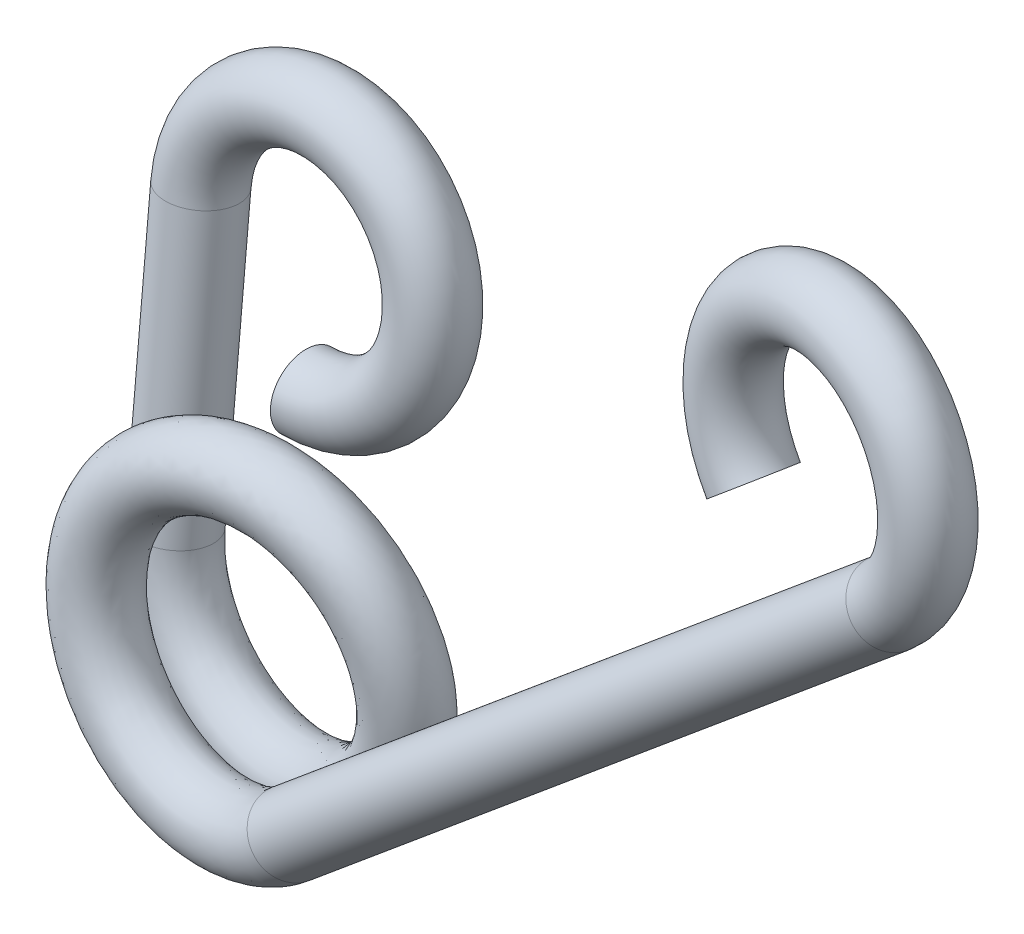
ISO-10303-21;
HEADER;
FILE_DESCRIPTION(('STEP AP214'),'2;1');
FILE_NAME('part.step','',(''),(''),'','','');
FILE_SCHEMA(('AUTOMOTIVE_DESIGN { 1 0 10303 214 1 1 1 1 }'));
ENDSEC;
DATA;
#1=APPLICATION_CONTEXT('core data for automotive mechanical design processes');
#2=APPLICATION_PROTOCOL_DEFINITION('international standard','automotive_design',2000,#1);
#3=PRODUCT_CONTEXT('',#1,'mechanical');
#4=PRODUCT('Part','Part','',(#3));
#5=PRODUCT_RELATED_PRODUCT_CATEGORY('part','',(#4));
#6=PRODUCT_DEFINITION_FORMATION('','',#4);
#7=PRODUCT_DEFINITION_CONTEXT('part definition',#1,'design');
#8=PRODUCT_DEFINITION('design','',#6,#7);
#9=PRODUCT_DEFINITION_SHAPE('','',#8);
#10=(LENGTH_UNIT() NAMED_UNIT(*) SI_UNIT(.MILLI.,.METRE.));
#11=(NAMED_UNIT(*) PLANE_ANGLE_UNIT() SI_UNIT($,.RADIAN.));
#12=(NAMED_UNIT(*) SI_UNIT($,.STERADIAN.) SOLID_ANGLE_UNIT());
#13=UNCERTAINTY_MEASURE_WITH_UNIT(LENGTH_MEASURE(1.E-05),#10,'distance_accuracy_value','');
#14=(GEOMETRIC_REPRESENTATION_CONTEXT(3) GLOBAL_UNCERTAINTY_ASSIGNED_CONTEXT((#13)) GLOBAL_UNIT_ASSIGNED_CONTEXT((#10,
#11,#12)) REPRESENTATION_CONTEXT('',''));
#15=CARTESIAN_POINT('',(0.,0.,0.));
#16=DIRECTION('',(0.,0.,1.));
#17=DIRECTION('',(1.,0.,0.));
#18=AXIS2_PLACEMENT_3D('',#15,#16,#17);
#19=CARTESIAN_POINT('',(-2.925,-0.0704165836283418,-0.765267113333714));
#20=CARTESIAN_POINT('',(-2.90212026503772,-1.02080669510959,-0.680712434641493));
#21=CARTESIAN_POINT('',(-2.32498487917316,-1.77624007579664,-0.596157755949272));
#22=CARTESIAN_POINT('',(-1.7478494933086,-2.53167345648368,-0.511603077257051));
#23=CARTESIAN_POINT('',(-0.836904557831744,-2.80360023119031,-0.42704839856483));
#24=CARTESIAN_POINT('',(0.074040377645116,-3.07552700589693,-0.342493719872609));
#25=CARTESIAN_POINT('',(0.970844859261698,-2.76008038913634,-0.257939041180388));
#26=CARTESIAN_POINT('',(1.86764934087828,-2.44463377237575,-0.173384362488167));
#27=CARTESIAN_POINT('',(2.40776453792028,-1.66230365011433,-0.0888296837959465));
#28=CARTESIAN_POINT('',(2.94787973496228,-0.87997352785291,-0.00427500510372558));
#29=CARTESIAN_POINT('',(2.925,0.0704165836283414,0.0802796735884954));
#30=CARTESIAN_POINT('',(2.90212026503772,1.02080669510959,0.164834352280716));
#31=CARTESIAN_POINT('',(2.32498487917316,1.77624007579664,0.249389030972937));
#32=CARTESIAN_POINT('',(1.74784949330861,2.53167345648368,0.333943709665158));
#33=CARTESIAN_POINT('',(0.836904557831745,2.80360023119031,0.418498388357379));
#34=CARTESIAN_POINT('',(-0.0740403776451156,3.07552700589693,0.5030530670496));
#35=CARTESIAN_POINT('',(-0.970844859261698,2.76008038913634,0.587607745741821));
#36=CARTESIAN_POINT('',(-1.86764934087828,2.44463377237575,0.672162424434042));
#37=CARTESIAN_POINT('',(-2.40776453792028,1.66230365011433,0.756717103126263));
#38=CARTESIAN_POINT('',(-2.94787973496228,0.87997352785291,0.841271781818484));
#39=CARTESIAN_POINT('',(-2.925,-0.0704165836283418,0.925826460510705));
#40=CARTESIAN_POINT('',(-2.90212026503772,-1.02080669510959,1.01038113920293));
#41=CARTESIAN_POINT('',(-2.32498487917316,-1.77624007579664,1.09493581789515));
#42=CARTESIAN_POINT('',(-1.7478494933086,-2.53167345648368,1.17949049658737));
#43=CARTESIAN_POINT('',(-0.836904557831744,-2.80360023119031,1.26404517527959));
#44=CARTESIAN_POINT('',(0.074040377645116,-3.07552700589693,1.34859985397181));
#45=CARTESIAN_POINT('',(0.970844859261698,-2.76008038913634,1.43315453266403));
#46=CARTESIAN_POINT('',(1.5192311705279,-2.56718817002642,1.48485881079692));
#47=CARTESIAN_POINT('',(1.95222719081488,-2.17931009512022,1.53905817812549));
#48=CARTESIAN_POINT('',(-1.388,-0.0704165836283317,-0.765267113333715));
#49=CARTESIAN_POINT('',(-1.36512026503772,-0.521405121999606,-0.680712434641494));
#50=CARTESIAN_POINT('',(-1.08152575881887,-0.872814143023098,-0.596157755949273));
#51=CARTESIAN_POINT('',(-0.797931252600025,-1.22422316404659,-0.511603077257052));
#52=CARTESIAN_POINT('',(-0.36194543747746,-1.34182636564465,-0.427048398564831));
#53=CARTESIAN_POINT('',(0.0740403776451055,-1.45942956724271,-0.342493719872611));
#54=CARTESIAN_POINT('',(0.495885738907394,-1.29830652359069,-0.257939041180389));
#55=CARTESIAN_POINT('',(0.917731100169684,-1.13718347993867,-0.173384362488168));
#56=CARTESIAN_POINT('',(1.16430541756598,-0.758877717340808,-0.0888296837959475));
#57=CARTESIAN_POINT('',(1.41087973496228,-0.380571954742942,-0.00427500510372656));
#58=CARTESIAN_POINT('',(1.388,0.0704165836283316,0.0802796735884944));
#59=CARTESIAN_POINT('',(1.36512026503772,0.521405121999606,0.164834352280715));
#60=CARTESIAN_POINT('',(1.08152575881887,0.872814143023098,0.249389030972936));
#61=CARTESIAN_POINT('',(0.797931252600025,1.22422316404659,0.333943709665157));
#62=CARTESIAN_POINT('',(0.36194543747746,1.34182636564465,0.418498388357378));
#63=CARTESIAN_POINT('',(-0.0740403776451053,1.45942956724271,0.503053067049599));
#64=CARTESIAN_POINT('',(-0.495885738907394,1.29830652359069,0.58760774574182));
#65=CARTESIAN_POINT('',(-0.917731100169683,1.13718347993867,0.672162424434041));
#66=CARTESIAN_POINT('',(-1.16430541756598,0.758877717340808,0.756717103126262));
#67=CARTESIAN_POINT('',(-1.41087973496228,0.380571954742943,0.841271781818483));
#68=CARTESIAN_POINT('',(-1.388,-0.0704165836283317,0.925826460510704));
#69=CARTESIAN_POINT('',(-1.36512026503772,-0.521405121999606,1.01038113920293));
#70=CARTESIAN_POINT('',(-1.08152575881887,-0.872814143023098,1.09493581789515));
#71=CARTESIAN_POINT('',(-0.797931252600025,-1.22422316404659,1.17949049658737));
#72=CARTESIAN_POINT('',(-0.36194543747746,-1.34182636564465,1.26404517527959));
#73=CARTESIAN_POINT('',(0.0740403776451055,-1.45942956724271,1.34859985397181));
#74=CARTESIAN_POINT('',(0.495885738907394,-1.29830652359069,1.43315453266403));
#75=CARTESIAN_POINT('',(0.753839647846812,-1.19978151242099,1.48485881079692));
#76=CARTESIAN_POINT('',(0.95453711154986,-1.01012939662399,1.53905817812549));
#77=CARTESIAN_POINT('',(-1.388,0.070416583628311,0.765267113333713));
#78=CARTESIAN_POINT('',(-1.41087973496227,-0.380571954742963,0.849821792025934));
#79=CARTESIAN_POINT('',(-1.16430541756597,-0.758877717340824,0.934376470718155));
#80=CARTESIAN_POINT('',(-0.917731100169666,-1.13718347993869,1.01893114941038));
#81=CARTESIAN_POINT('',(-0.495885738907375,-1.2983065235907,1.1034858281026));
#82=CARTESIAN_POINT('',(-0.0740403776450839,-1.45942956724271,1.18804050679482));
#83=CARTESIAN_POINT('',(0.361945437477479,-1.34182636564465,1.27259518548704));
#84=CARTESIAN_POINT('',(0.797931252600042,-1.22422316404658,1.35714986417926));
#85=CARTESIAN_POINT('',(1.08152575881889,-0.872814143023081,1.44170454287148));
#86=CARTESIAN_POINT('',(1.36512026503773,-0.521405121999585,1.5262592215637));
#87=CARTESIAN_POINT('',(1.388,-0.0704165836283111,1.61081390025592));
#88=CARTESIAN_POINT('',(1.41087973496227,0.380571954742963,1.69536857894814));
#89=CARTESIAN_POINT('',(1.16430541756597,0.758877717340824,1.77992325764037));
#90=CARTESIAN_POINT('',(0.917731100169666,1.13718347993869,1.86447793633259));
#91=CARTESIAN_POINT('',(0.495885738907375,1.2983065235907,1.94903261502481));
#92=CARTESIAN_POINT('',(0.0740403776450841,1.45942956724271,2.03358729371703));
#93=CARTESIAN_POINT('',(-0.361945437477479,1.34182636564465,2.11814197240925));
#94=CARTESIAN_POINT('',(-0.797931252600042,1.22422316404658,2.20269665110147));
#95=CARTESIAN_POINT('',(-1.08152575881889,0.872814143023081,2.28725132979369));
#96=CARTESIAN_POINT('',(-1.36512026503773,0.521405121999585,2.37180600848591));
#97=CARTESIAN_POINT('',(-1.388,0.070416583628311,2.45636068717813));
#98=CARTESIAN_POINT('',(-1.41087973496227,-0.380571954742963,2.54091536587035));
#99=CARTESIAN_POINT('',(-1.16430541756597,-0.758877717340824,2.62547004456257));
#100=CARTESIAN_POINT('',(-0.917731100169666,-1.13718347993869,2.7100247232548));
#101=CARTESIAN_POINT('',(-0.495885738907375,-1.2983065235907,2.79457940194702));
#102=CARTESIAN_POINT('',(-0.0740403776450839,-1.45942956724271,2.87913408063924));
#103=CARTESIAN_POINT('',(0.361945437477479,-1.34182636564465,2.96368875933146));
#104=CARTESIAN_POINT('',(0.628546082122418,-1.26991327060613,3.01539303746435));
#105=CARTESIAN_POINT('',(0.847406714110328,-1.10154634769973,3.06959240479292));
#106=CARTESIAN_POINT('',(-2.925,0.0704165836283009,0.765267113333714));
#107=CARTESIAN_POINT('',(-2.94787973496227,-0.87997352785295,0.849821792025935));
#108=CARTESIAN_POINT('',(-2.40776453792026,-1.66230365011436,0.934376470718156));
#109=CARTESIAN_POINT('',(-1.86764934087825,-2.44463377237578,1.01893114941038));
#110=CARTESIAN_POINT('',(-0.97084485926166,-2.76008038913636,1.1034858281026));
#111=CARTESIAN_POINT('',(-0.0740403776450734,-3.07552700589693,1.18804050679482));
#112=CARTESIAN_POINT('',(0.836904557831783,-2.80360023119029,1.27259518548704));
#113=CARTESIAN_POINT('',(1.74784949330864,-2.53167345648366,1.35714986417926));
#114=CARTESIAN_POINT('',(2.32498487917319,-1.7762400757966,1.44170454287148));
#115=CARTESIAN_POINT('',(2.90212026503773,-1.02080669510955,1.5262592215637));
#116=CARTESIAN_POINT('',(2.925,-0.0704165836283013,1.61081390025592));
#117=CARTESIAN_POINT('',(2.94787973496227,0.87997352785295,1.69536857894815));
#118=CARTESIAN_POINT('',(2.40776453792026,1.66230365011436,1.77992325764037));
#119=CARTESIAN_POINT('',(1.86764934087825,2.44463377237578,1.86447793633259));
#120=CARTESIAN_POINT('',(0.97084485926166,2.76008038913636,1.94903261502481));
#121=CARTESIAN_POINT('',(0.0740403776450738,3.07552700589693,2.03358729371703));
#122=CARTESIAN_POINT('',(-0.836904557831783,2.80360023119029,2.11814197240925));
#123=CARTESIAN_POINT('',(-1.74784949330864,2.53167345648366,2.20269665110147));
#124=CARTESIAN_POINT('',(-2.32498487917319,1.77624007579661,2.28725132979369));
#125=CARTESIAN_POINT('',(-2.90212026503773,1.02080669510955,2.37180600848591));
#126=CARTESIAN_POINT('',(-2.925,0.0704165836283009,2.45636068717813));
#127=CARTESIAN_POINT('',(-2.94787973496227,-0.87997352785295,2.54091536587035));
#128=CARTESIAN_POINT('',(-2.40776453792026,-1.66230365011436,2.62547004456258));
#129=CARTESIAN_POINT('',(-1.86764934087825,-2.44463377237578,2.7100247232548));
#130=CARTESIAN_POINT('',(-0.97084485926166,-2.76008038913636,2.79457940194702));
#131=CARTESIAN_POINT('',(-0.0740403776450734,-3.07552700589693,2.87913408063924));
#132=CARTESIAN_POINT('',(0.836904557831783,-2.80360023119029,2.96368875933146));
#133=CARTESIAN_POINT('',(1.39393760480351,-2.63731992821156,3.01539303746435));
#134=CARTESIAN_POINT('',(1.84509679337535,-2.27072704619597,3.06959240479292));
#135=CARTESIAN_POINT('',(-4.462,0.0704165836282909,0.765267113333715));
#136=CARTESIAN_POINT('',(-4.48487973496226,-1.37937510096294,0.849821792025936));
#137=CARTESIAN_POINT('',(-3.65122365827454,-2.5657295828879,0.934376470718157));
#138=CARTESIAN_POINT('',(-2.81756758158683,-3.75208406481287,1.01893114941038));
#139=CARTESIAN_POINT('',(-1.44580397961594,-4.22185425468201,1.1034858281026));
#140=CARTESIAN_POINT('',(-0.074040377645063,-4.69162444455115,1.18804050679482));
#141=CARTESIAN_POINT('',(1.31186367818609,-4.26537409673594,1.27259518548704));
#142=CARTESIAN_POINT('',(2.69776773401724,-3.83912374892074,1.35714986417926));
#143=CARTESIAN_POINT('',(3.56844399952749,-2.67966600857013,1.44170454287148));
#144=CARTESIAN_POINT('',(4.43912026503774,-1.52020826821952,1.5262592215637));
#145=CARTESIAN_POINT('',(4.462,-0.0704165836282915,1.61081390025592));
#146=CARTESIAN_POINT('',(4.48487973496226,1.37937510096294,1.69536857894815));
#147=CARTESIAN_POINT('',(3.65122365827454,2.5657295828879,1.77992325764037));
#148=CARTESIAN_POINT('',(2.81756758158683,3.75208406481287,1.86447793633259));
#149=CARTESIAN_POINT('',(1.44580397961594,4.22185425468201,1.94903261502481));
#150=CARTESIAN_POINT('',(0.0740403776450636,4.69162444455115,2.03358729371703));
#151=CARTESIAN_POINT('',(-1.31186367818609,4.26537409673594,2.11814197240925));
#152=CARTESIAN_POINT('',(-2.69776773401724,3.83912374892074,2.20269665110147));
#153=CARTESIAN_POINT('',(-3.56844399952749,2.67966600857013,2.28725132979369));
#154=CARTESIAN_POINT('',(-4.43912026503774,1.52020826821952,2.37180600848591));
#155=CARTESIAN_POINT('',(-4.462,0.0704165836282909,2.45636068717813));
#156=CARTESIAN_POINT('',(-4.48487973496226,-1.37937510096294,2.54091536587036));
#157=CARTESIAN_POINT('',(-3.65122365827454,-2.5657295828879,2.62547004456258));
#158=CARTESIAN_POINT('',(-2.81756758158683,-3.75208406481287,2.7100247232548));
#159=CARTESIAN_POINT('',(-1.44580397961594,-4.22185425468201,2.79457940194702));
#160=CARTESIAN_POINT('',(-0.074040377645063,-4.69162444455115,2.87913408063924));
#161=CARTESIAN_POINT('',(1.31186367818609,-4.26537409673594,2.96368875933146));
#162=CARTESIAN_POINT('',(2.1593291274846,-4.004726585817,3.01539303746435));
#163=CARTESIAN_POINT('',(2.84278687264038,-3.43990774469221,3.06959240479292));
#164=CARTESIAN_POINT('',(-4.462,-0.0704165836283518,-0.765267113333713));
#165=CARTESIAN_POINT('',(-4.43912026503772,-1.52020826821958,-0.680712434641492));
#166=CARTESIAN_POINT('',(-3.56844399952745,-2.67966600857018,-0.596157755949271));
#167=CARTESIAN_POINT('',(-2.69776773401719,-3.83912374892077,-0.51160307725705));
#168=CARTESIAN_POINT('',(-1.31186367818603,-4.26537409673596,-0.427048398564829));
#169=CARTESIAN_POINT('',(0.0740403776451265,-4.69162444455115,-0.342493719872609));
#170=CARTESIAN_POINT('',(1.445803979616,-4.22185425468199,-0.257939041180387));
#171=CARTESIAN_POINT('',(2.81756758158688,-3.75208406481283,-0.173384362488166));
#172=CARTESIAN_POINT('',(3.65122365827458,-2.56572958288785,-0.0888296837959456));
#173=CARTESIAN_POINT('',(4.48487973496228,-1.37937510096288,-0.00427500510372461));
#174=CARTESIAN_POINT('',(4.462,0.0704165836283513,0.0802796735884963));
#175=CARTESIAN_POINT('',(4.43912026503772,1.52020826821958,0.164834352280717));
#176=CARTESIAN_POINT('',(3.56844399952745,2.67966600857018,0.249389030972938));
#177=CARTESIAN_POINT('',(2.69776773401719,3.83912374892077,0.333943709665159));
#178=CARTESIAN_POINT('',(1.31186367818603,4.26537409673596,0.41849838835738));
#179=CARTESIAN_POINT('',(-0.0740403776451259,4.69162444455115,0.503053067049601));
#180=CARTESIAN_POINT('',(-1.445803979616,4.22185425468199,0.587607745741822));
#181=CARTESIAN_POINT('',(-2.81756758158688,3.75208406481283,0.672162424434043));
#182=CARTESIAN_POINT('',(-3.65122365827458,2.56572958288786,0.756717103126264));
#183=CARTESIAN_POINT('',(-4.48487973496228,1.37937510096288,0.841271781818485));
#184=CARTESIAN_POINT('',(-4.462,-0.0704165836283518,0.925826460510706));
#185=CARTESIAN_POINT('',(-4.43912026503772,-1.52020826821958,1.01038113920293));
#186=CARTESIAN_POINT('',(-3.56844399952745,-2.67966600857018,1.09493581789515));
#187=CARTESIAN_POINT('',(-2.69776773401719,-3.83912374892077,1.17949049658737));
#188=CARTESIAN_POINT('',(-1.31186367818603,-4.26537409673596,1.26404517527959));
#189=CARTESIAN_POINT('',(0.0740403776451265,-4.69162444455115,1.34859985397181));
#190=CARTESIAN_POINT('',(1.445803979616,-4.22185425468199,1.43315453266403));
#191=CARTESIAN_POINT('',(2.28462269320899,-3.93459482763186,1.48485881079692));
#192=CARTESIAN_POINT('',(2.94991727007991,-3.34849079361646,1.53905817812549));
#193=CARTESIAN_POINT('',(-2.925,-0.0704165836283418,-0.765267113333714));
#194=CARTESIAN_POINT('',(-2.90212026503772,-1.02080669510959,-0.680712434641493));
#195=CARTESIAN_POINT('',(-2.32498487917316,-1.77624007579664,-0.596157755949272));
#196=CARTESIAN_POINT('',(-1.7478494933086,-2.53167345648368,-0.511603077257051));
#197=CARTESIAN_POINT('',(-0.836904557831744,-2.80360023119031,-0.42704839856483));
#198=CARTESIAN_POINT('',(0.074040377645116,-3.07552700589693,-0.342493719872609));
#199=CARTESIAN_POINT('',(0.970844859261698,-2.76008038913634,-0.257939041180388));
#200=CARTESIAN_POINT('',(1.86764934087828,-2.44463377237575,-0.173384362488167));
#201=CARTESIAN_POINT('',(2.40776453792028,-1.66230365011433,-0.0888296837959465));
#202=CARTESIAN_POINT('',(2.94787973496228,-0.87997352785291,-0.00427500510372558));
#203=CARTESIAN_POINT('',(2.925,0.0704165836283414,0.0802796735884954));
#204=CARTESIAN_POINT('',(2.90212026503772,1.02080669510959,0.164834352280716));
#205=CARTESIAN_POINT('',(2.32498487917316,1.77624007579664,0.249389030972937));
#206=CARTESIAN_POINT('',(1.74784949330861,2.53167345648368,0.333943709665158));
#207=CARTESIAN_POINT('',(0.836904557831745,2.80360023119031,0.418498388357379));
#208=CARTESIAN_POINT('',(-0.0740403776451156,3.07552700589693,0.5030530670496));
#209=CARTESIAN_POINT('',(-0.970844859261698,2.76008038913634,0.587607745741821));
#210=CARTESIAN_POINT('',(-1.86764934087828,2.44463377237575,0.672162424434042));
#211=CARTESIAN_POINT('',(-2.40776453792028,1.66230365011433,0.756717103126263));
#212=CARTESIAN_POINT('',(-2.94787973496228,0.87997352785291,0.841271781818484));
#213=CARTESIAN_POINT('',(-2.925,-0.0704165836283418,0.925826460510705));
#214=CARTESIAN_POINT('',(-2.90212026503772,-1.02080669510959,1.01038113920293));
#215=CARTESIAN_POINT('',(-2.32498487917316,-1.77624007579664,1.09493581789515));
#216=CARTESIAN_POINT('',(-1.7478494933086,-2.53167345648368,1.17949049658737));
#217=CARTESIAN_POINT('',(-0.836904557831744,-2.80360023119031,1.26404517527959));
#218=CARTESIAN_POINT('',(0.074040377645116,-3.07552700589693,1.34859985397181));
#219=CARTESIAN_POINT('',(0.970844859261698,-2.76008038913634,1.43315453266403));
#220=CARTESIAN_POINT('',(1.5192311705279,-2.56718817002642,1.48485881079692));
#221=CARTESIAN_POINT('',(1.95222719081488,-2.17931009512022,1.53905817812549));
#222=(BOUNDED_SURFACE() B_SPLINE_SURFACE(3,2,((#19,#20,#21,#22,#23,#24,#25,#26,#27,#28,#29,#30,
#31,#32,#33,#34,#35,#36,#37,#38,#39,#40,#41,#42,#43,#44,#45,#46,#47),(#48,#49,#50,#51,#52,#53,
#54,#55,#56,#57,#58,#59,#60,#61,#62,#63,#64,#65,#66,#67,#68,#69,#70,#71,#72,#73,#74,#75,#76),
(#77,#78,#79,#80,#81,#82,#83,#84,#85,#86,#87,#88,#89,#90,#91,#92,#93,#94,#95,#96,#97,#98,#99,
#100,#101,#102,#103,#104,#105),(#106,#107,#108,#109,#110,#111,#112,#113,#114,#115,#116,#117,
#118,#119,#120,#121,#122,#123,#124,#125,#126,#127,#128,#129,#130,#131,#132,#133,#134),(#135,
#136,#137,#138,#139,#140,#141,#142,#143,#144,#145,#146,#147,#148,#149,#150,#151,#152,#153,#154,
#155,#156,#157,#158,#159,#160,#161,#162,#163),(#164,#165,#166,#167,#168,#169,#170,#171,#172,
#173,#174,#175,#176,#177,#178,#179,#180,#181,#182,#183,#184,#185,#186,#187,#188,#189,#190,#191,
#192),(#193,#194,#195,#196,#197,#198,#199,#200,#201,#202,#203,#204,#205,#206,#207,#208,#209,
#210,#211,#212,#213,#214,#215,#216,#217,#218,#219,#220,#221)),.UNSPECIFIED.,.T.,.F.,
.F.) B_SPLINE_SURFACE_WITH_KNOTS((4,3,4),(3,2,2,2,2,2,2,2,2,2,2,2,2,2,3),(0.,0.5,1.),(0.,0.05,
0.1,0.15,0.2,0.25,0.3,0.35,0.4,0.45,0.5,0.55,0.6,0.65,0.681167107840135),
.UNSPECIFIED.) GEOMETRIC_REPRESENTATION_ITEM() RATIONAL_B_SPLINE_SURFACE(((1.,0.951056516295154,
1.,0.951056516295154,1.,0.951056516295154,1.,0.951056516295154,1.,0.951056516295154,1.,
0.951056516295154,1.,0.951056516295154,1.,0.951056516295154,1.,0.951056516295154,1.,
0.951056516295154,1.,0.951056516295154,1.,0.951056516295154,1.,0.951056516295154,1.,
0.969491463305984,0.977017440739452),(0.333333333333333,0.317018838765051,0.333333333333333,
0.317018838765051,0.333333333333333,0.317018838765051,0.333333333333333,0.317018838765051,
0.333333333333333,0.317018838765051,0.333333333333333,0.317018838765051,0.333333333333333,
0.317018838765051,0.333333333333333,0.317018838765051,0.333333333333333,0.317018838765051,
0.333333333333333,0.317018838765051,0.333333333333333,0.317018838765051,0.333333333333333,
0.317018838765051,0.333333333333333,0.317018838765051,0.333333333333333,0.323163821101995,
0.325672480246484),(0.333333333333333,0.317018838765051,0.333333333333333,0.317018838765051,
0.333333333333333,0.317018838765051,0.333333333333333,0.317018838765051,0.333333333333333,
0.317018838765051,0.333333333333333,0.317018838765051,0.333333333333333,0.317018838765051,
0.333333333333333,0.317018838765051,0.333333333333333,0.317018838765051,0.333333333333333,
0.317018838765051,0.333333333333333,0.317018838765051,0.333333333333333,0.317018838765051,
0.333333333333333,0.317018838765051,0.333333333333333,0.323163821101995,0.325672480246484),(1.,
0.951056516295154,1.,0.951056516295154,1.,0.951056516295154,1.,0.951056516295154,1.,
0.951056516295154,1.,0.951056516295154,1.,0.951056516295154,1.,0.951056516295154,1.,
0.951056516295154,1.,0.951056516295154,1.,0.951056516295154,1.,0.951056516295154,1.,
0.951056516295154,1.,0.969491463305984,0.977017440739452),(0.333333333333333,0.317018838765051,
0.333333333333333,0.317018838765051,0.333333333333333,0.317018838765051,0.333333333333333,
0.317018838765051,0.333333333333333,0.317018838765051,0.333333333333333,0.317018838765051,
0.333333333333333,0.317018838765051,0.333333333333333,0.317018838765051,0.333333333333333,
0.317018838765051,0.333333333333333,0.317018838765051,0.333333333333333,0.317018838765051,
0.333333333333333,0.317018838765051,0.333333333333333,0.317018838765051,0.333333333333333,
0.323163821101995,0.325672480246484),(0.333333333333333,0.317018838765051,0.333333333333333,
0.317018838765051,0.333333333333333,0.317018838765051,0.333333333333333,0.317018838765051,
0.333333333333333,0.317018838765051,0.333333333333333,0.317018838765051,0.333333333333333,
0.317018838765051,0.333333333333333,0.317018838765051,0.333333333333333,0.317018838765051,
0.333333333333333,0.317018838765051,0.333333333333333,0.317018838765051,0.333333333333333,
0.317018838765051,0.333333333333333,0.317018838765051,0.333333333333333,0.323163821101995,
0.325672480246484),(1.,0.951056516295154,1.,0.951056516295154,1.,0.951056516295154,1.,
0.951056516295154,1.,0.951056516295154,1.,0.951056516295154,1.,0.951056516295154,1.,
0.951056516295154,1.,0.951056516295154,1.,0.951056516295154,1.,0.951056516295154,1.,
0.951056516295154,1.,0.951056516295154,1.,0.969491463305984,0.977017440739452))) REPRESENTATION_ITEM('') SURFACE());
#223=CARTESIAN_POINT('',(-2.925,0.,0.));
#224=DIRECTION('',(0.,0.995793250922205,-0.0916286058924155));
#225=DIRECTION('',(0.,0.0916286058924155,0.995793250922205));
#226=AXIS2_PLACEMENT_3D('',#223,#224,#225);
#227=CIRCLE('',#226,0.7685);
#228=CARTESIAN_POINT('',(-2.925,0.0704165836283021,0.765267113333715));
#229=VERTEX_POINT('',#228);
#230=EDGE_CURVE('E49',#229,#229,#227,.T.);
#231=CARTESIAN_POINT('',(1.95222719081488,-2.17931009512022,1.53905817812549));
#232=CARTESIAN_POINT('',(2.94991727007991,-3.34849079361646,1.53905817812549));
#233=CARTESIAN_POINT('',(2.84278687264038,-3.43990774469221,3.06959240479292));
#234=CARTESIAN_POINT('',(1.84509679337535,-2.27072704619597,3.06959240479292));
#235=CARTESIAN_POINT('',(0.847406714110328,-1.10154634769973,3.06959240479292));
#236=CARTESIAN_POINT('',(0.95453711154986,-1.01012939662399,1.53905817812549));
#237=CARTESIAN_POINT('',(1.95222719081488,-2.17931009512022,1.53905817812549));
#238=(BOUNDED_CURVE() B_SPLINE_CURVE(3,(#231,#232,#233,#234,#235,#236,#237),.UNSPECIFIED.,.T.,
.F.) B_SPLINE_CURVE_WITH_KNOTS((4,3,4),(0.,0.5,1.),
.UNSPECIFIED.) CURVE() GEOMETRIC_REPRESENTATION_ITEM() RATIONAL_B_SPLINE_CURVE((0.977017440739452,
0.325672480246484,0.325672480246484,0.977017440739452,0.325672480246484,0.325672480246484,0.977017440739452)) REPRESENTATION_ITEM(''));
#239=CARTESIAN_POINT('',(1.95222719081488,-2.17931009512022,1.53905817812549));
#240=VERTEX_POINT('',#239);
#241=EDGE_CURVE('E63',#240,#240,#238,.F.);
#242=ORIENTED_EDGE('',*,*,#230,.F.);
#243=EDGE_LOOP('',(#242));
#244=FACE_BOUND('',#243,.T.);
#245=ORIENTED_EDGE('',*,*,#241,.F.);
#246=EDGE_LOOP('',(#245));
#247=FACE_BOUND('',#246,.T.);
#248=ADVANCED_FACE('F37',(#244,#247),#222,.T.);
#249=CARTESIAN_POINT('',(-2.92500000000004,6.0862883496365,-0.560034039214444));
#250=DIRECTION('',(0.,-0.995793250922205,0.0916286058924155));
#251=DIRECTION('',(0.,-0.0916286058924155,-0.995793250922205));
#252=AXIS2_PLACEMENT_3D('',#249,#250,#251);
#253=CYLINDRICAL_SURFACE('',#252,0.7685);
#254=CARTESIAN_POINT('',(-2.92500000000004,6.0862883496365,-0.560034039214444));
#255=DIRECTION('',(0.,0.995793250922205,-0.0916286058924155));
#256=DIRECTION('',(0.,0.0916286058924155,0.995793250922205));
#257=AXIS2_PLACEMENT_3D('',#254,#255,#256);
#258=CIRCLE('',#257,0.7685);
#259=CARTESIAN_POINT('',(-3.69350000000004,6.0862883496365,-0.560034039214444));
#260=VERTEX_POINT('',#259);
#261=EDGE_CURVE('E11',#260,#260,#258,.T.);
#262=ORIENTED_EDGE('',*,*,#261,.F.);
#263=EDGE_LOOP('',(#262));
#264=FACE_BOUND('',#263,.T.);
#265=ORIENTED_EDGE('',*,*,#230,.T.);
#266=EDGE_LOOP('',(#265));
#267=FACE_BOUND('',#266,.T.);
#268=ADVANCED_FACE('F93',(#264,#267),#253,.T.);
#269=CARTESIAN_POINT('',(16.625784073203,10.3419897757369,4.08576864721955));
#270=DIRECTION('',(-0.75749007720954,-0.646384546157547,-0.0916286058924155));
#271=DIRECTION('',(0.649115210972689,-0.7606901096267,0.));
#272=AXIS2_PLACEMENT_3D('',#269,#270,#271);
#273=CYLINDRICAL_SURFACE('',#272,0.7685);
#274=CARTESIAN_POINT('',(16.625784073203,10.3419897757369,4.08576864721955));
#275=DIRECTION('',(0.75749007720954,0.646384546157547,0.0916286058924155));
#276=DIRECTION('',(-0.649115210972689,0.7606901096267,0.));
#277=AXIS2_PLACEMENT_3D('',#274,#275,#276);
#278=CIRCLE('',#277,0.7685);
#279=CARTESIAN_POINT('',(17.1145293095132,9.75615354967415,4.17805223306553));
#280=VERTEX_POINT('',#279);
#281=EDGE_CURVE('E54',#280,#280,#278,.T.);
#282=ORIENTED_EDGE('',*,*,#281,.F.);
#283=EDGE_LOOP('',(#282));
#284=FACE_BOUND('',#283,.T.);
#285=ORIENTED_EDGE('',*,*,#241,.T.);
#286=EDGE_LOOP('',(#285));
#287=FACE_BOUND('',#286,.T.);
#288=ADVANCED_FACE('F72',(#284,#287),#273,.T.);
#289=CARTESIAN_POINT('',(-0.425000000000058,3.59680522233098,-0.330962524483404));
#290=DIRECTION('',(-1.,0.,0.));
#291=DIRECTION('',(0.,0.0916286058924158,0.995793250922205));
#292=AXIS2_PLACEMENT_3D('',#289,#290,#291);
#293=PLANE('',#292);
#294=CARTESIAN_POINT('',(-0.425000000000058,3.59680522233098,-0.330962524483404));
#295=DIRECTION('',(-1.,0.,0.));
#296=DIRECTION('',(0.,0.0916286058924158,0.995793250922205));
#297=AXIS2_PLACEMENT_3D('',#294,#295,#296);
#298=CIRCLE('',#297,0.7685);
#299=CARTESIAN_POINT('',(-0.425000000000063,2.83153810899726,-0.260545940855082));
#300=VERTEX_POINT('',#299);
#301=EDGE_CURVE('E73',#300,#300,#298,.T.);
#302=ORIENTED_EDGE('',*,*,#301,.T.);
#303=EDGE_LOOP('',(#302));
#304=FACE_BOUND('',#303,.T.);
#305=ADVANCED_FACE('F89',(#304),#293,.T.);
#306=CARTESIAN_POINT('',(-0.425000000000041,6.08628834963649,-0.560034039214443));
#307=DIRECTION('',(0.,-0.0916286058924155,-0.995793250922204));
#308=DIRECTION('',(0.,0.995793250922204,-0.0916286058924155));
#309=AXIS2_PLACEMENT_3D('',#306,#307,#308);
#310=TOROIDAL_SURFACE('',#309,2.5,0.7685);
#311=CARTESIAN_POINT('',(-0.425000000000041,6.08628834963649,-0.560034039214443));
#312=DIRECTION('',(0.,-0.0916286058924155,-0.995793250922204));
#313=DIRECTION('',(0.,0.995793250922204,-0.0916286058924155));
#314=AXIS2_PLACEMENT_3D('',#311,#312,#313);
#315=CIRCLE('',#314,3.2685);
#316=EDGE_CURVE('',#260,#300,#315,.T.);
#317=ORIENTED_EDGE('',*,*,#261,.T.);
#318=ORIENTED_EDGE('',*,*,#301,.F.);
#319=ORIENTED_EDGE('',*,*,#316,.T.);
#320=ORIENTED_EDGE('',*,*,#316,.F.);
#321=EDGE_LOOP('',(#317,#319,#318,#320));
#322=FACE_BOUND('',#321,.T.);
#323=ADVANCED_FACE('F94',(#322),#310,.T.);
#324=CARTESIAN_POINT('',(13.1421264263398,10.6318066343599,3.55649028198109));
#325=DIRECTION('',(0.635972981535741,-0.762311289606737,0.120082740202969));
#326=DIRECTION('',(0.734178904151129,0.645609353813104,0.210166360220835));
#327=AXIS2_PLACEMENT_3D('',#324,#325,#326);
#328=PLANE('',#327);
#329=CARTESIAN_POINT('',(13.1421264263398,10.6318066343599,3.55649028198109));
#330=DIRECTION('',(0.635972981535741,-0.762311289606737,0.120082740202969));
#331=DIRECTION('',(0.734178904151129,0.645609353813104,0.210166360220835));
#332=AXIS2_PLACEMENT_3D('',#329,#330,#331);
#333=CIRCLE('',#332,0.768499999999999);
#334=CARTESIAN_POINT('',(12.5599953020043,10.1350601106378,3.48607369835277));
#335=VERTEX_POINT('',#334);
#336=EDGE_CURVE('E76',#335,#335,#333,.T.);
#337=ORIENTED_EDGE('',*,*,#336,.T.);
#338=EDGE_LOOP('',(#337));
#339=FACE_BOUND('',#338,.T.);
#340=ADVANCED_FACE('F83',(#339),#328,.T.);
#341=CARTESIAN_POINT('',(15.0358516193637,12.2477679997538,3.78556179671213));
#342=DIRECTION('',(-0.147469148250165,0.032688166464517,0.988526344660353));
#343=DIRECTION('',(0.989054896492697,0.,0.14754799803393));
#344=AXIS2_PLACEMENT_3D('',#341,#342,#343);
#345=TOROIDAL_SURFACE('',#344,2.5,0.768499999999999);
#346=CARTESIAN_POINT('',(15.0358516193637,12.2477679997538,3.78556179671213));
#347=DIRECTION('',(-0.147469148250165,0.032688166464517,0.988526344660353));
#348=DIRECTION('',(0.989054896492697,0.,0.14754799803393));
#349=AXIS2_PLACEMENT_3D('',#346,#347,#348);
#350=CIRCLE('',#349,3.2685);
#351=EDGE_CURVE('',#280,#335,#350,.T.);
#352=ORIENTED_EDGE('',*,*,#281,.T.);
#353=ORIENTED_EDGE('',*,*,#336,.F.);
#354=ORIENTED_EDGE('',*,*,#351,.T.);
#355=ORIENTED_EDGE('',*,*,#351,.F.);
#356=EDGE_LOOP('',(#352,#354,#353,#355));
#357=FACE_BOUND('',#356,.T.);
#358=ADVANCED_FACE('F85',(#357),#345,.T.);
#359=CLOSED_SHELL('',(#248,#268,#288,#305,#323,#340,#358));
#360=MANIFOLD_SOLID_BREP('B2',#359);
#361=ADVANCED_BREP_SHAPE_REPRESENTATION('',(#18,#360),#14);
#362=SHAPE_DEFINITION_REPRESENTATION(#9,#361);
ENDSEC;
END-ISO-10303-21;
